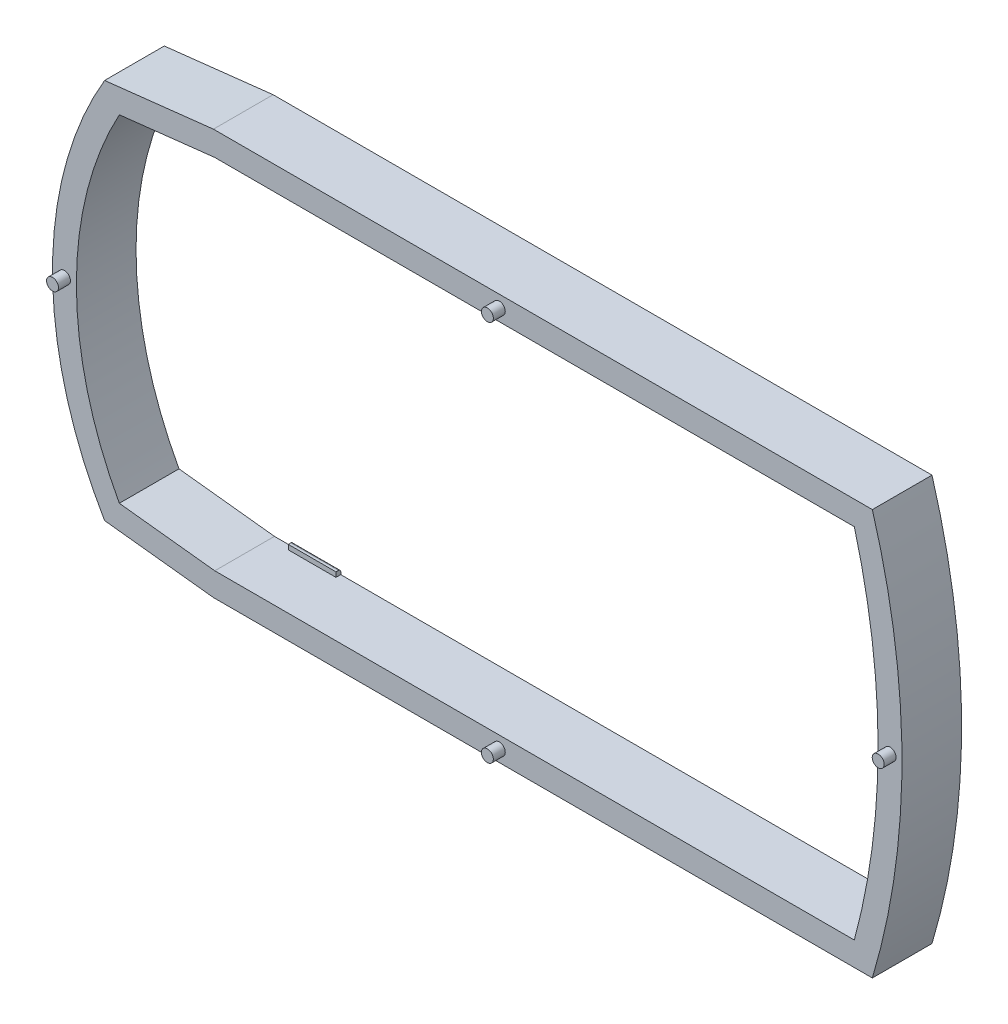
ISO-10303-21;
HEADER;
FILE_DESCRIPTION(('STEP AP214'),'2;1');
FILE_NAME('part.step','',(''),(''),'','','');
FILE_SCHEMA(('AUTOMOTIVE_DESIGN { 1 0 10303 214 1 1 1 1 }'));
ENDSEC;
DATA;
#1=APPLICATION_CONTEXT('core data for automotive mechanical design processes');
#2=APPLICATION_PROTOCOL_DEFINITION('international standard','automotive_design',2000,#1);
#3=PRODUCT_CONTEXT('',#1,'mechanical');
#4=PRODUCT('Part','Part','',(#3));
#5=PRODUCT_RELATED_PRODUCT_CATEGORY('part','',(#4));
#6=PRODUCT_DEFINITION_FORMATION('','',#4);
#7=PRODUCT_DEFINITION_CONTEXT('part definition',#1,'design');
#8=PRODUCT_DEFINITION('design','',#6,#7);
#9=PRODUCT_DEFINITION_SHAPE('','',#8);
#10=(LENGTH_UNIT() NAMED_UNIT(*) SI_UNIT(.MILLI.,.METRE.));
#11=(NAMED_UNIT(*) PLANE_ANGLE_UNIT() SI_UNIT($,.RADIAN.));
#12=(NAMED_UNIT(*) SI_UNIT($,.STERADIAN.) SOLID_ANGLE_UNIT());
#13=UNCERTAINTY_MEASURE_WITH_UNIT(LENGTH_MEASURE(1.E-05),#10,'distance_accuracy_value','');
#14=(GEOMETRIC_REPRESENTATION_CONTEXT(3) GLOBAL_UNCERTAINTY_ASSIGNED_CONTEXT((#13)) GLOBAL_UNIT_ASSIGNED_CONTEXT((#10,
#11,#12)) REPRESENTATION_CONTEXT('',''));
#15=CARTESIAN_POINT('',(0.,0.,0.));
#16=DIRECTION('',(0.,0.,1.));
#17=DIRECTION('',(1.,0.,0.));
#18=AXIS2_PLACEMENT_3D('',#15,#16,#17);
#19=CARTESIAN_POINT('',(0.,-14.6550184722738,2.));
#20=DIRECTION('',(0.,-1.,0.));
#21=DIRECTION('',(1.,0.,0.));
#22=AXIS2_PLACEMENT_3D('',#19,#20,#21);
#23=PLANE('',#22);
#24=DIRECTION('',(-1.,0.,0.));
#25=VECTOR('',#24,1.);
#26=CARTESIAN_POINT('',(0.,-14.6550184722738,0.));
#27=LINE('',#26,#25);
#28=CARTESIAN_POINT('',(124.911892491481,-14.6550184722737,0.));
#29=VERTEX_POINT('',#28);
#30=CARTESIAN_POINT('',(122.411892491481,-14.6550184722737,0.));
#31=VERTEX_POINT('',#30);
#32=EDGE_CURVE('E164',#29,#31,#27,.T.);
#33=ORIENTED_EDGE('',*,*,#32,.T.);
#34=CARTESIAN_POINT('',(122.411892491481,-14.6550184722737,0.5));
#35=DIRECTION('',(0.,-1.,0.));
#36=DIRECTION('',(1.,0.,0.));
#37=AXIS2_PLACEMENT_3D('',#34,#35,#36);
#38=CIRCLE('',#37,0.5);
#39=CARTESIAN_POINT('',(121.911892491481,-14.6550184722737,0.5));
#40=VERTEX_POINT('',#39);
#41=EDGE_CURVE('E13',#31,#40,#38,.F.);
#42=ORIENTED_EDGE('',*,*,#41,.T.);
#43=DIRECTION('',(0.,0.,-1.));
#44=VECTOR('',#43,1.);
#45=CARTESIAN_POINT('',(121.911892491481,-14.6550184722737,2.));
#46=LINE('',#45,#44);
#47=CARTESIAN_POINT('',(121.911892491481,-14.6550184722737,2.));
#48=VERTEX_POINT('',#47);
#49=EDGE_CURVE('E132',#48,#40,#46,.T.);
#50=ORIENTED_EDGE('',*,*,#49,.F.);
#51=DIRECTION('',(-1.,0.,0.));
#52=VECTOR('',#51,1.);
#53=CARTESIAN_POINT('',(0.,-14.6550184722738,2.));
#54=LINE('',#53,#52);
#55=CARTESIAN_POINT('',(124.911892491481,-14.6550184722737,2.));
#56=VERTEX_POINT('',#55);
#57=EDGE_CURVE('E139',#56,#48,#54,.T.);
#58=ORIENTED_EDGE('',*,*,#57,.F.);
#59=DIRECTION('',(0.,0.,-1.));
#60=VECTOR('',#59,1.);
#61=CARTESIAN_POINT('',(124.911892491481,-14.6550184722737,2.));
#62=LINE('',#61,#60);
#63=EDGE_CURVE('E158',#56,#29,#62,.T.);
#64=ORIENTED_EDGE('',*,*,#63,.T.);
#65=EDGE_LOOP('',(#33,#42,#50,#58,#64));
#66=FACE_BOUND('',#65,.T.);
#67=ADVANCED_FACE('F80',(#66),#23,.F.);
#68=CARTESIAN_POINT('',(121.911892491481,0.,2.));
#69=DIRECTION('',(1.,0.,0.));
#70=DIRECTION('',(0.,0.,-1.));
#71=AXIS2_PLACEMENT_3D('',#68,#69,#70);
#72=PLANE('',#71);
#73=ORIENTED_EDGE('',*,*,#49,.T.);
#74=DIRECTION('',(0.,-1.,0.));
#75=VECTOR('',#74,1.);
#76=CARTESIAN_POINT('',(121.911892491481,0.,0.5));
#77=LINE('',#76,#75);
#78=CARTESIAN_POINT('',(121.911892491481,-39.6550184722737,0.5));
#79=VERTEX_POINT('',#78);
#80=EDGE_CURVE('E150',#40,#79,#77,.T.);
#81=ORIENTED_EDGE('',*,*,#80,.T.);
#82=DIRECTION('',(0.,0.,-1.));
#83=VECTOR('',#82,1.);
#84=CARTESIAN_POINT('',(121.911892491481,-39.6550184722737,2.));
#85=LINE('',#84,#83);
#86=CARTESIAN_POINT('',(121.911892491481,-39.6550184722737,2.));
#87=VERTEX_POINT('',#86);
#88=EDGE_CURVE('E134',#87,#79,#85,.T.);
#89=ORIENTED_EDGE('',*,*,#88,.F.);
#90=DIRECTION('',(0.,-1.,0.));
#91=VECTOR('',#90,1.);
#92=CARTESIAN_POINT('',(121.911892491481,0.,2.));
#93=LINE('',#92,#91);
#94=EDGE_CURVE('E127',#48,#87,#93,.T.);
#95=ORIENTED_EDGE('',*,*,#94,.F.);
#96=EDGE_LOOP('',(#73,#81,#89,#95));
#97=FACE_BOUND('',#96,.T.);
#98=ADVANCED_FACE('F129',(#97),#72,.F.);
#99=CARTESIAN_POINT('',(0.,-39.6550184722737,2.));
#100=DIRECTION('',(0.,-1.,0.));
#101=DIRECTION('',(0.,0.,-1.));
#102=AXIS2_PLACEMENT_3D('',#99,#100,#101);
#103=PLANE('',#102);
#104=ORIENTED_EDGE('',*,*,#88,.T.);
#105=CARTESIAN_POINT('',(122.411892491481,-39.6550184722737,0.5));
#106=DIRECTION('',(0.,-1.,0.));
#107=DIRECTION('',(0.,0.,-1.));
#108=AXIS2_PLACEMENT_3D('',#105,#106,#107);
#109=CIRCLE('',#108,0.5);
#110=CARTESIAN_POINT('',(122.411892491481,-39.6550184722737,0.));
#111=VERTEX_POINT('',#110);
#112=EDGE_CURVE('E102',#79,#111,#109,.T.);
#113=ORIENTED_EDGE('',*,*,#112,.T.);
#114=DIRECTION('',(-1.,0.,0.));
#115=VECTOR('',#114,1.);
#116=CARTESIAN_POINT('',(0.,-39.6550184722737,0.));
#117=LINE('',#116,#115);
#118=CARTESIAN_POINT('',(124.911892491481,-39.6550184722737,0.));
#119=VERTEX_POINT('',#118);
#120=EDGE_CURVE('E162',#119,#111,#117,.T.);
#121=ORIENTED_EDGE('',*,*,#120,.F.);
#122=DIRECTION('',(0.,0.,-1.));
#123=VECTOR('',#122,1.);
#124=CARTESIAN_POINT('',(124.911892491481,-39.6550184722737,2.));
#125=LINE('',#124,#123);
#126=CARTESIAN_POINT('',(124.911892491481,-39.6550184722737,2.));
#127=VERTEX_POINT('',#126);
#128=EDGE_CURVE('E153',#127,#119,#125,.T.);
#129=ORIENTED_EDGE('',*,*,#128,.F.);
#130=DIRECTION('',(-1.,0.,0.));
#131=VECTOR('',#130,1.);
#132=CARTESIAN_POINT('',(0.,-39.6550184722737,2.));
#133=LINE('',#132,#131);
#134=EDGE_CURVE('E138',#127,#87,#133,.T.);
#135=ORIENTED_EDGE('',*,*,#134,.T.);
#136=EDGE_LOOP('',(#104,#113,#121,#129,#135));
#137=FACE_BOUND('',#136,.T.);
#138=ADVANCED_FACE('F167',(#137),#103,.T.);
#139=CARTESIAN_POINT('',(124.911892491481,0.,2.));
#140=DIRECTION('',(1.,0.,0.));
#141=DIRECTION('',(0.,0.,-1.));
#142=AXIS2_PLACEMENT_3D('',#139,#140,#141);
#143=PLANE('',#142);
#144=DIRECTION('',(0.,-1.,0.));
#145=VECTOR('',#144,1.);
#146=CARTESIAN_POINT('',(124.911892491481,0.,0.));
#147=LINE('',#146,#145);
#148=EDGE_CURVE('E147',#29,#119,#147,.T.);
#149=ORIENTED_EDGE('',*,*,#148,.F.);
#150=ORIENTED_EDGE('',*,*,#63,.F.);
#151=DIRECTION('',(0.,-1.,0.));
#152=VECTOR('',#151,1.);
#153=CARTESIAN_POINT('',(124.911892491481,0.,2.));
#154=LINE('',#153,#152);
#155=EDGE_CURVE('E145',#56,#127,#154,.T.);
#156=ORIENTED_EDGE('',*,*,#155,.T.);
#157=ORIENTED_EDGE('',*,*,#128,.T.);
#158=EDGE_LOOP('',(#149,#150,#156,#157));
#159=FACE_BOUND('',#158,.T.);
#160=ADVANCED_FACE('F170',(#159),#143,.T.);
#161=CARTESIAN_POINT('',(0.,0.,2.));
#162=DIRECTION('',(0.,0.,1.));
#163=DIRECTION('',(1.,0.,0.));
#164=AXIS2_PLACEMENT_3D('',#161,#162,#163);
#165=PLANE('',#164);
#166=ORIENTED_EDGE('',*,*,#57,.T.);
#167=ORIENTED_EDGE('',*,*,#94,.T.);
#168=ORIENTED_EDGE('',*,*,#134,.F.);
#169=ORIENTED_EDGE('',*,*,#155,.F.);
#170=EDGE_LOOP('',(#166,#167,#168,#169));
#171=FACE_BOUND('',#170,.T.);
#172=ADVANCED_FACE('F143',(#171),#165,.T.);
#173=CARTESIAN_POINT('',(0.,0.,0.));
#174=DIRECTION('',(0.,0.,1.));
#175=DIRECTION('',(1.,0.,0.));
#176=AXIS2_PLACEMENT_3D('',#173,#174,#175);
#177=PLANE('',#176);
#178=ORIENTED_EDGE('',*,*,#120,.T.);
#179=DIRECTION('',(0.,-1.,0.));
#180=VECTOR('',#179,1.);
#181=CARTESIAN_POINT('',(122.411892491481,0.,0.));
#182=LINE('',#181,#180);
#183=EDGE_CURVE('E88',#111,#31,#182,.F.);
#184=ORIENTED_EDGE('',*,*,#183,.T.);
#185=ORIENTED_EDGE('',*,*,#32,.F.);
#186=ORIENTED_EDGE('',*,*,#148,.T.);
#187=EDGE_LOOP('',(#178,#184,#185,#186));
#188=FACE_BOUND('',#187,.T.);
#189=ADVANCED_FACE('F171',(#188),#177,.F.);
#190=CARTESIAN_POINT('',(122.411892491481,0.,0.5));
#191=DIRECTION('',(0.,-1.,0.));
#192=DIRECTION('',(0.,0.,-1.));
#193=AXIS2_PLACEMENT_3D('',#190,#191,#192);
#194=CYLINDRICAL_SURFACE('',#193,0.5);
#195=ORIENTED_EDGE('',*,*,#41,.F.);
#196=ORIENTED_EDGE('',*,*,#183,.F.);
#197=ORIENTED_EDGE('',*,*,#112,.F.);
#198=ORIENTED_EDGE('',*,*,#80,.F.);
#199=EDGE_LOOP('',(#195,#196,#197,#198));
#200=FACE_BOUND('',#199,.T.);
#201=ADVANCED_FACE('F82',(#200),#194,.T.);
#202=CLOSED_SHELL('',(#67,#98,#138,#160,#172,#189,#201));
#203=MANIFOLD_SOLID_BREP('B2',#202);
#204=CARTESIAN_POINT('',(-152.77598661219,-102.155018472274,25.));
#205=DIRECTION('',(0.,1.,0.));
#206=DIRECTION('',(0.,0.,1.));
#207=AXIS2_PLACEMENT_3D('',#204,#205,#206);
#208=PLANE('',#207);
#209=DIRECTION('',(1.,0.,0.));
#210=VECTOR('',#209,1.);
#211=CARTESIAN_POINT('',(-152.77598661219,-102.155018472274,0.));
#212=LINE('',#211,#210);
#213=CARTESIAN_POINT('',(-124.987389645968,-102.155018472274,0.));
#214=VERTEX_POINT('',#213);
#215=CARTESIAN_POINT('',(115.22401338781,-102.155018472274,0.));
#216=VERTEX_POINT('',#215);
#217=EDGE_CURVE('E463',#214,#216,#212,.T.);
#218=ORIENTED_EDGE('',*,*,#217,.F.);
#219=DIRECTION('',(0.,0.,-1.));
#220=VECTOR('',#219,1.);
#221=CARTESIAN_POINT('',(-124.987389645968,-102.155018472274,2.));
#222=LINE('',#221,#220);
#223=CARTESIAN_POINT('',(-124.987389645968,-102.155018472274,2.));
#224=VERTEX_POINT('',#223);
#225=EDGE_CURVE('E441',#224,#214,#222,.T.);
#226=ORIENTED_EDGE('',*,*,#225,.F.);
#227=DIRECTION('',(1.,0.,0.));
#228=VECTOR('',#227,1.);
#229=CARTESIAN_POINT('',(0.,-102.155018472274,2.));
#230=LINE('',#229,#228);
#231=CARTESIAN_POINT('',(-144.987389645968,-102.155018472274,2.));
#232=VERTEX_POINT('',#231);
#233=EDGE_CURVE('E419',#232,#224,#230,.T.);
#234=ORIENTED_EDGE('',*,*,#233,.F.);
#235=DIRECTION('',(0.,0.,-1.));
#236=VECTOR('',#235,1.);
#237=CARTESIAN_POINT('',(-144.987389645968,-102.155018472274,2.));
#238=LINE('',#237,#236);
#239=CARTESIAN_POINT('',(-144.987389645968,-102.155018472274,0.));
#240=VERTEX_POINT('',#239);
#241=EDGE_CURVE('E431',#232,#240,#238,.T.);
#242=ORIENTED_EDGE('',*,*,#241,.T.);
#243=CARTESIAN_POINT('',(-152.77598661219,-102.155018472274,0.));
#244=VERTEX_POINT('',#243);
#245=EDGE_CURVE('E464',#244,#240,#212,.T.);
#246=ORIENTED_EDGE('',*,*,#245,.F.);
#247=DIRECTION('',(0.,0.,-1.));
#248=VECTOR('',#247,1.);
#249=CARTESIAN_POINT('',(-152.77598661219,-102.155018472274,25.));
#250=LINE('',#249,#248);
#251=CARTESIAN_POINT('',(-152.77598661219,-102.155018472274,25.));
#252=VERTEX_POINT('',#251);
#253=EDGE_CURVE('E490',#252,#244,#250,.T.);
#254=ORIENTED_EDGE('',*,*,#253,.F.);
#255=DIRECTION('',(1.,0.,0.));
#256=VECTOR('',#255,1.);
#257=CARTESIAN_POINT('',(-152.77598661219,-102.155018472274,25.));
#258=LINE('',#257,#256);
#259=CARTESIAN_POINT('',(115.22401338781,-102.155018472274,25.));
#260=VERTEX_POINT('',#259);
#261=EDGE_CURVE('E446',#252,#260,#258,.T.);
#262=ORIENTED_EDGE('',*,*,#261,.T.);
#263=DIRECTION('',(0.,0.,-1.));
#264=VECTOR('',#263,1.);
#265=CARTESIAN_POINT('',(115.22401338781,-102.155018472274,25.));
#266=LINE('',#265,#264);
#267=EDGE_CURVE('E487',#260,#216,#266,.T.);
#268=ORIENTED_EDGE('',*,*,#267,.T.);
#269=EDGE_LOOP('',(#218,#226,#234,#242,#246,#254,#262,#268));
#270=FACE_BOUND('',#269,.T.);
#271=ADVANCED_FACE('F229',(#270),#208,.T.);
#272=CARTESIAN_POINT('',(-162.17906632426,-27.1550184722737,25.));
#273=DIRECTION('',(0.,0.,1.));
#274=DIRECTION('',(1.,0.,0.));
#275=AXIS2_PLACEMENT_3D('',#272,#273,#274);
#276=PLANE('',#275);
#277=CARTESIAN_POINT('',(-215.77598661219,-27.1550184722737,25.));
#278=DIRECTION('',(0.,0.,1.));
#279=DIRECTION('',(1.,0.,0.));
#280=AXIS2_PLACEMENT_3D('',#277,#278,#279);
#281=CIRCLE('',#280,2.5);
#282=CARTESIAN_POINT('',(-213.27598661219,-27.1550184722737,25.));
#283=VERTEX_POINT('',#282);
#284=EDGE_CURVE('E610',#283,#283,#281,.F.);
#285=ORIENTED_EDGE('',*,*,#284,.T.);
#286=EDGE_LOOP('',(#285));
#287=FACE_BOUND('',#286,.T.);
#288=CARTESIAN_POINT('',(130.22401338781,-27.1550184722737,25.));
#289=DIRECTION('',(0.,0.,1.));
#290=DIRECTION('',(1.,0.,0.));
#291=AXIS2_PLACEMENT_3D('',#288,#289,#290);
#292=CIRCLE('',#291,2.5);
#293=CARTESIAN_POINT('',(132.72401338781,-27.1550184722737,25.));
#294=VERTEX_POINT('',#293);
#295=EDGE_CURVE('E604',#294,#294,#292,.F.);
#296=ORIENTED_EDGE('',*,*,#295,.T.);
#297=EDGE_LOOP('',(#296));
#298=FACE_BOUND('',#297,.T.);
#299=CARTESIAN_POINT('',(-33.5490270948265,52.8449815277263,25.));
#300=DIRECTION('',(0.,0.,1.));
#301=DIRECTION('',(1.,0.,0.));
#302=AXIS2_PLACEMENT_3D('',#299,#300,#301);
#303=CIRCLE('',#302,2.5);
#304=CARTESIAN_POINT('',(-31.0490270948265,52.8449815277263,25.));
#305=VERTEX_POINT('',#304);
#306=EDGE_CURVE('E598',#305,#305,#303,.F.);
#307=ORIENTED_EDGE('',*,*,#306,.T.);
#308=EDGE_LOOP('',(#307));
#309=FACE_BOUND('',#308,.T.);
#310=CARTESIAN_POINT('',(-33.5490270948265,-107.155018472274,25.));
#311=DIRECTION('',(0.,0.,1.));
#312=DIRECTION('',(1.,0.,0.));
#313=AXIS2_PLACEMENT_3D('',#310,#311,#312);
#314=CIRCLE('',#313,2.5);
#315=CARTESIAN_POINT('',(-31.0490270948265,-107.155018472274,25.));
#316=VERTEX_POINT('',#315);
#317=EDGE_CURVE('E411',#316,#316,#314,.F.);
#318=ORIENTED_EDGE('',*,*,#317,.T.);
#319=EDGE_LOOP('',(#318));
#320=FACE_BOUND('',#319,.T.);
#321=DIRECTION('',(0.993731316158802,-0.111794773067865,0.));
#322=VECTOR('',#321,1.);
#323=CARTESIAN_POINT('',(-193.893934342868,-107.592331633862,25.));
#324=LINE('',#323,#322);
#325=CARTESIAN_POINT('',(-198.953146911768,-107.023170219861,25.));
#326=VERTEX_POINT('',#325);
#327=CARTESIAN_POINT('',(-153.336718001429,-112.155018472274,25.));
#328=VERTEX_POINT('',#327);
#329=EDGE_CURVE('E494',#326,#328,#324,.T.);
#330=ORIENTED_EDGE('',*,*,#329,.T.);
#331=DIRECTION('',(1.,0.,0.));
#332=VECTOR('',#331,1.);
#333=CARTESIAN_POINT('',(-152.77598661219,-112.155018472274,25.));
#334=LINE('',#333,#332);
#335=CARTESIAN_POINT('',(122.776592961627,-112.155018472274,25.));
#336=VERTEX_POINT('',#335);
#337=EDGE_CURVE('E497',#328,#336,#334,.T.);
#338=ORIENTED_EDGE('',*,*,#337,.T.);
#339=CARTESIAN_POINT('',(-162.17906632426,-27.1550184722737,25.));
#340=DIRECTION('',(0.,0.,1.));
#341=DIRECTION('',(1.,0.,0.));
#342=AXIS2_PLACEMENT_3D('',#339,#340,#341);
#343=CIRCLE('',#342,297.362956265663);
#344=CARTESIAN_POINT('',(122.776592961627,57.8449815277263,25.));
#345=VERTEX_POINT('',#344);
#346=EDGE_CURVE('E500',#336,#345,#343,.T.);
#347=ORIENTED_EDGE('',*,*,#346,.T.);
#348=DIRECTION('',(1.,0.,0.));
#349=VECTOR('',#348,1.);
#350=CARTESIAN_POINT('',(-152.77598661219,57.8449815277263,25.));
#351=LINE('',#350,#349);
#352=CARTESIAN_POINT('',(-153.336718001428,57.8449815277263,25.));
#353=VERTEX_POINT('',#352);
#354=EDGE_CURVE('E502',#353,#345,#351,.T.);
#355=ORIENTED_EDGE('',*,*,#354,.F.);
#356=DIRECTION('',(0.993731316158802,0.111794773067865,0.));
#357=VECTOR('',#356,1.);
#358=CARTESIAN_POINT('',(-193.893934342868,53.2822946893143,25.));
#359=LINE('',#358,#357);
#360=CARTESIAN_POINT('',(-198.953146911768,52.713133275313,25.));
#361=VERTEX_POINT('',#360);
#362=EDGE_CURVE('E505',#361,#353,#359,.T.);
#363=ORIENTED_EDGE('',*,*,#362,.F.);
#364=CARTESIAN_POINT('',(-63.7022368600632,-27.1550184722737,25.));
#365=DIRECTION('',(0.,0.,1.));
#366=DIRECTION('',(1.,0.,0.));
#367=AXIS2_PLACEMENT_3D('',#364,#365,#366);
#368=CIRCLE('',#367,157.072372915767);
#369=EDGE_CURVE('E508',#326,#361,#368,.F.);
#370=ORIENTED_EDGE('',*,*,#369,.F.);
#371=EDGE_LOOP('',(#330,#338,#347,#355,#363,#370));
#372=FACE_BOUND('',#371,.T.);
#373=ORIENTED_EDGE('',*,*,#261,.F.);
#374=DIRECTION('',(0.993731316158802,-0.111794773067865,0.));
#375=VECTOR('',#374,1.);
#376=CARTESIAN_POINT('',(-192.77598661219,-97.6550184722737,25.));
#377=LINE('',#376,#375);
#378=CARTESIAN_POINT('',(-192.77598661219,-97.6550184722738,25.));
#379=VERTEX_POINT('',#378);
#380=EDGE_CURVE('E444',#379,#252,#377,.T.);
#381=ORIENTED_EDGE('',*,*,#380,.F.);
#382=CARTESIAN_POINT('',(-63.7022368600632,-27.1550184722737,25.));
#383=DIRECTION('',(0.,0.,-1.));
#384=DIRECTION('',(-1.,0.,0.));
#385=AXIS2_PLACEMENT_3D('',#382,#383,#384);
#386=CIRCLE('',#385,147.072372915767);
#387=CARTESIAN_POINT('',(-192.77598661219,43.3449815277263,25.));
#388=VERTEX_POINT('',#387);
#389=EDGE_CURVE('E457',#379,#388,#386,.T.);
#390=ORIENTED_EDGE('',*,*,#389,.T.);
#391=DIRECTION('',(0.993731316158802,0.111794773067865,0.));
#392=VECTOR('',#391,1.);
#393=CARTESIAN_POINT('',(-192.77598661219,43.3449815277263,25.));
#394=LINE('',#393,#392);
#395=CARTESIAN_POINT('',(-152.77598661219,47.8449815277263,25.));
#396=VERTEX_POINT('',#395);
#397=EDGE_CURVE('E454',#388,#396,#394,.T.);
#398=ORIENTED_EDGE('',*,*,#397,.T.);
#399=DIRECTION('',(1.,0.,0.));
#400=VECTOR('',#399,1.);
#401=CARTESIAN_POINT('',(-152.77598661219,47.8449815277263,25.));
#402=LINE('',#401,#400);
#403=CARTESIAN_POINT('',(115.22401338781,47.8449815277262,25.));
#404=VERTEX_POINT('',#403);
#405=EDGE_CURVE('E451',#396,#404,#402,.T.);
#406=ORIENTED_EDGE('',*,*,#405,.T.);
#407=CARTESIAN_POINT('',(-162.17906632426,-27.1550184722737,25.));
#408=DIRECTION('',(0.,0.,1.));
#409=DIRECTION('',(1.,0.,0.));
#410=AXIS2_PLACEMENT_3D('',#407,#408,#409);
#411=CIRCLE('',#410,287.362956265663);
#412=EDGE_CURVE('E449',#260,#404,#411,.T.);
#413=ORIENTED_EDGE('',*,*,#412,.F.);
#414=EDGE_LOOP('',(#373,#381,#390,#398,#406,#413));
#415=FACE_BOUND('',#414,.T.);
#416=ADVANCED_FACE('F572',(#287,#298,#309,#320,#372,#415),#276,.T.);
#417=CARTESIAN_POINT('',(-162.17906632426,-27.1550184722737,0.));
#418=DIRECTION('',(0.,0.,1.));
#419=DIRECTION('',(1.,0.,0.));
#420=AXIS2_PLACEMENT_3D('',#417,#418,#419);
#421=PLANE('',#420);
#422=DIRECTION('',(0.993731316158802,-0.111794773067865,0.));
#423=VECTOR('',#422,1.);
#424=CARTESIAN_POINT('',(-193.893934342868,-107.592331633862,0.));
#425=LINE('',#424,#423);
#426=CARTESIAN_POINT('',(-198.953146911768,-107.023170219861,0.));
#427=VERTEX_POINT('',#426);
#428=CARTESIAN_POINT('',(-153.336718001429,-112.155018472274,0.));
#429=VERTEX_POINT('',#428);
#430=EDGE_CURVE('E493',#427,#429,#425,.T.);
#431=ORIENTED_EDGE('',*,*,#430,.F.);
#432=CARTESIAN_POINT('',(-63.7022368600632,-27.1550184722737,0.));
#433=DIRECTION('',(0.,0.,1.));
#434=DIRECTION('',(1.,0.,0.));
#435=AXIS2_PLACEMENT_3D('',#432,#433,#434);
#436=CIRCLE('',#435,157.072372915767);
#437=CARTESIAN_POINT('',(-198.953146911768,52.713133275313,0.));
#438=VERTEX_POINT('',#437);
#439=EDGE_CURVE('E498',#427,#438,#436,.F.);
#440=ORIENTED_EDGE('',*,*,#439,.T.);
#441=DIRECTION('',(0.993731316158802,0.111794773067865,0.));
#442=VECTOR('',#441,1.);
#443=CARTESIAN_POINT('',(-193.893934342868,53.2822946893143,0.));
#444=LINE('',#443,#442);
#445=CARTESIAN_POINT('',(-153.336718001428,57.8449815277263,0.));
#446=VERTEX_POINT('',#445);
#447=EDGE_CURVE('E522',#438,#446,#444,.T.);
#448=ORIENTED_EDGE('',*,*,#447,.T.);
#449=DIRECTION('',(1.,0.,0.));
#450=VECTOR('',#449,1.);
#451=CARTESIAN_POINT('',(-152.77598661219,57.8449815277263,0.));
#452=LINE('',#451,#450);
#453=CARTESIAN_POINT('',(122.776592961627,57.8449815277263,0.));
#454=VERTEX_POINT('',#453);
#455=EDGE_CURVE('E519',#446,#454,#452,.T.);
#456=ORIENTED_EDGE('',*,*,#455,.T.);
#457=CARTESIAN_POINT('',(-162.17906632426,-27.1550184722737,0.));
#458=DIRECTION('',(0.,0.,1.));
#459=DIRECTION('',(1.,0.,0.));
#460=AXIS2_PLACEMENT_3D('',#457,#458,#459);
#461=CIRCLE('',#460,297.362956265663);
#462=CARTESIAN_POINT('',(122.776592961627,-112.155018472274,0.));
#463=VERTEX_POINT('',#462);
#464=EDGE_CURVE('E516',#463,#454,#461,.T.);
#465=ORIENTED_EDGE('',*,*,#464,.F.);
#466=DIRECTION('',(1.,0.,0.));
#467=VECTOR('',#466,1.);
#468=CARTESIAN_POINT('',(-152.77598661219,-112.155018472274,0.));
#469=LINE('',#468,#467);
#470=EDGE_CURVE('E514',#429,#463,#469,.T.);
#471=ORIENTED_EDGE('',*,*,#470,.F.);
#472=EDGE_LOOP('',(#431,#440,#448,#456,#465,#471));
#473=FACE_BOUND('',#472,.T.);
#474=DIRECTION('',(0.,1.,0.));
#475=VECTOR('',#474,1.);
#476=CARTESIAN_POINT('',(-144.987389645968,0.,0.));
#477=LINE('',#476,#475);
#478=CARTESIAN_POINT('',(-144.987389645968,-101.155018472274,0.));
#479=VERTEX_POINT('',#478);
#480=EDGE_CURVE('E423',#240,#479,#477,.T.);
#481=ORIENTED_EDGE('',*,*,#480,.T.);
#482=DIRECTION('',(1.,0.,0.));
#483=VECTOR('',#482,1.);
#484=CARTESIAN_POINT('',(-124.987389645968,-101.155018472274,0.));
#485=LINE('',#484,#483);
#486=CARTESIAN_POINT('',(-124.987389645968,-101.155018472274,0.));
#487=VERTEX_POINT('',#486);
#488=EDGE_CURVE('E547',#479,#487,#485,.T.);
#489=ORIENTED_EDGE('',*,*,#488,.T.);
#490=DIRECTION('',(0.,1.,0.));
#491=VECTOR('',#490,1.);
#492=CARTESIAN_POINT('',(-124.987389645968,0.,0.));
#493=LINE('',#492,#491);
#494=EDGE_CURVE('E418',#214,#487,#493,.T.);
#495=ORIENTED_EDGE('',*,*,#494,.F.);
#496=ORIENTED_EDGE('',*,*,#217,.T.);
#497=CARTESIAN_POINT('',(-162.17906632426,-27.1550184722737,0.));
#498=DIRECTION('',(0.,0.,1.));
#499=DIRECTION('',(1.,0.,0.));
#500=AXIS2_PLACEMENT_3D('',#497,#498,#499);
#501=CIRCLE('',#500,287.362956265663);
#502=CARTESIAN_POINT('',(115.22401338781,47.8449815277262,0.));
#503=VERTEX_POINT('',#502);
#504=EDGE_CURVE('E467',#216,#503,#501,.T.);
#505=ORIENTED_EDGE('',*,*,#504,.T.);
#506=DIRECTION('',(1.,0.,0.));
#507=VECTOR('',#506,1.);
#508=CARTESIAN_POINT('',(-152.77598661219,47.8449815277263,0.));
#509=LINE('',#508,#507);
#510=CARTESIAN_POINT('',(-124.987389645968,47.8449815277263,0.));
#511=VERTEX_POINT('',#510);
#512=EDGE_CURVE('E470',#511,#503,#509,.T.);
#513=ORIENTED_EDGE('',*,*,#512,.F.);
#514=DIRECTION('',(0.,-1.,0.));
#515=VECTOR('',#514,1.);
#516=CARTESIAN_POINT('',(-124.987389645968,8.67274236079684E-13,0.));
#517=LINE('',#516,#515);
#518=CARTESIAN_POINT('',(-124.987389645968,46.8449815277263,0.));
#519=VERTEX_POINT('',#518);
#520=EDGE_CURVE('E407',#511,#519,#517,.T.);
#521=ORIENTED_EDGE('',*,*,#520,.T.);
#522=DIRECTION('',(1.,0.,0.));
#523=VECTOR('',#522,1.);
#524=CARTESIAN_POINT('',(-162.17906632426,46.8449815277263,0.));
#525=LINE('',#524,#523);
#526=CARTESIAN_POINT('',(-144.987389645968,46.8449815277263,0.));
#527=VERTEX_POINT('',#526);
#528=EDGE_CURVE('E544',#519,#527,#525,.F.);
#529=ORIENTED_EDGE('',*,*,#528,.T.);
#530=DIRECTION('',(0.,-1.,0.));
#531=VECTOR('',#530,1.);
#532=CARTESIAN_POINT('',(-144.987389645968,0.,0.));
#533=LINE('',#532,#531);
#534=CARTESIAN_POINT('',(-144.987389645968,47.8449815277263,0.));
#535=VERTEX_POINT('',#534);
#536=EDGE_CURVE('E410',#535,#527,#533,.T.);
#537=ORIENTED_EDGE('',*,*,#536,.F.);
#538=CARTESIAN_POINT('',(-152.77598661219,47.8449815277263,0.));
#539=VERTEX_POINT('',#538);
#540=EDGE_CURVE('E471',#539,#535,#509,.T.);
#541=ORIENTED_EDGE('',*,*,#540,.F.);
#542=DIRECTION('',(0.993731316158802,0.111794773067865,0.));
#543=VECTOR('',#542,1.);
#544=CARTESIAN_POINT('',(-192.77598661219,43.3449815277263,0.));
#545=LINE('',#544,#543);
#546=CARTESIAN_POINT('',(-192.77598661219,43.3449815277263,0.));
#547=VERTEX_POINT('',#546);
#548=EDGE_CURVE('E473',#547,#539,#545,.T.);
#549=ORIENTED_EDGE('',*,*,#548,.F.);
#550=CARTESIAN_POINT('',(-63.7022368600632,-27.1550184722737,0.));
#551=DIRECTION('',(0.,0.,-1.));
#552=DIRECTION('',(-1.,0.,0.));
#553=AXIS2_PLACEMENT_3D('',#550,#551,#552);
#554=CIRCLE('',#553,147.072372915767);
#555=CARTESIAN_POINT('',(-192.77598661219,-97.6550184722738,0.));
#556=VERTEX_POINT('',#555);
#557=EDGE_CURVE('E447',#556,#547,#554,.T.);
#558=ORIENTED_EDGE('',*,*,#557,.F.);
#559=DIRECTION('',(0.993731316158802,-0.111794773067865,0.));
#560=VECTOR('',#559,1.);
#561=CARTESIAN_POINT('',(-192.77598661219,-97.6550184722737,0.));
#562=LINE('',#561,#560);
#563=EDGE_CURVE('E443',#556,#244,#562,.T.);
#564=ORIENTED_EDGE('',*,*,#563,.T.);
#565=ORIENTED_EDGE('',*,*,#245,.T.);
#566=EDGE_LOOP('',(#481,#489,#495,#496,#505,#513,#521,#529,#537,#541,#549,#558,#564,#565));
#567=FACE_BOUND('',#566,.T.);
#568=ADVANCED_FACE('F553',(#473,#567),#421,.F.);
#569=CARTESIAN_POINT('',(-193.893934342868,-107.592331633862,25.));
#570=DIRECTION('',(0.111794773067865,0.993731316158802,0.));
#571=DIRECTION('',(-0.993731316158802,0.111794773067865,0.));
#572=AXIS2_PLACEMENT_3D('',#569,#570,#571);
#573=PLANE('',#572);
#574=ORIENTED_EDGE('',*,*,#430,.T.);
#575=DIRECTION('',(0.,0.,-1.));
#576=VECTOR('',#575,1.);
#577=CARTESIAN_POINT('',(-153.336718001429,-112.155018472274,25.));
#578=LINE('',#577,#576);
#579=EDGE_CURVE('E537',#328,#429,#578,.T.);
#580=ORIENTED_EDGE('',*,*,#579,.F.);
#581=ORIENTED_EDGE('',*,*,#329,.F.);
#582=DIRECTION('',(0.,0.,-1.));
#583=VECTOR('',#582,1.);
#584=CARTESIAN_POINT('',(-198.953146911768,-107.023170219861,25.));
#585=LINE('',#584,#583);
#586=EDGE_CURVE('E511',#326,#427,#585,.T.);
#587=ORIENTED_EDGE('',*,*,#586,.T.);
#588=EDGE_LOOP('',(#574,#580,#581,#587));
#589=FACE_BOUND('',#588,.T.);
#590=ADVANCED_FACE('F650',(#589),#573,.F.);
#591=CARTESIAN_POINT('',(-152.77598661219,-112.155018472274,25.));
#592=DIRECTION('',(0.,1.,0.));
#593=DIRECTION('',(0.,0.,1.));
#594=AXIS2_PLACEMENT_3D('',#591,#592,#593);
#595=PLANE('',#594);
#596=ORIENTED_EDGE('',*,*,#470,.T.);
#597=DIRECTION('',(0.,0.,-1.));
#598=VECTOR('',#597,1.);
#599=CARTESIAN_POINT('',(122.776592961627,-112.155018472274,25.));
#600=LINE('',#599,#598);
#601=EDGE_CURVE('E534',#336,#463,#600,.T.);
#602=ORIENTED_EDGE('',*,*,#601,.F.);
#603=ORIENTED_EDGE('',*,*,#337,.F.);
#604=ORIENTED_EDGE('',*,*,#579,.T.);
#605=EDGE_LOOP('',(#596,#602,#603,#604));
#606=FACE_BOUND('',#605,.T.);
#607=ADVANCED_FACE('F666',(#606),#595,.F.);
#608=CARTESIAN_POINT('',(-162.17906632426,-27.1550184722737,25.));
#609=DIRECTION('',(0.,0.,-1.));
#610=DIRECTION('',(-1.,0.,0.));
#611=AXIS2_PLACEMENT_3D('',#608,#609,#610);
#612=CYLINDRICAL_SURFACE('',#611,297.362956265663);
#613=ORIENTED_EDGE('',*,*,#464,.T.);
#614=DIRECTION('',(0.,0.,-1.));
#615=VECTOR('',#614,1.);
#616=CARTESIAN_POINT('',(122.776592961627,57.8449815277263,25.));
#617=LINE('',#616,#615);
#618=EDGE_CURVE('E532',#345,#454,#617,.T.);
#619=ORIENTED_EDGE('',*,*,#618,.F.);
#620=ORIENTED_EDGE('',*,*,#346,.F.);
#621=ORIENTED_EDGE('',*,*,#601,.T.);
#622=EDGE_LOOP('',(#613,#619,#620,#621));
#623=FACE_BOUND('',#622,.T.);
#624=ADVANCED_FACE('F662',(#623),#612,.T.);
#625=CARTESIAN_POINT('',(-152.77598661219,57.8449815277263,25.));
#626=DIRECTION('',(0.,1.,0.));
#627=DIRECTION('',(0.,0.,1.));
#628=AXIS2_PLACEMENT_3D('',#625,#626,#627);
#629=PLANE('',#628);
#630=ORIENTED_EDGE('',*,*,#455,.F.);
#631=DIRECTION('',(0.,0.,-1.));
#632=VECTOR('',#631,1.);
#633=CARTESIAN_POINT('',(-153.336718001428,57.8449815277263,25.));
#634=LINE('',#633,#632);
#635=EDGE_CURVE('E530',#353,#446,#634,.T.);
#636=ORIENTED_EDGE('',*,*,#635,.F.);
#637=ORIENTED_EDGE('',*,*,#354,.T.);
#638=ORIENTED_EDGE('',*,*,#618,.T.);
#639=EDGE_LOOP('',(#630,#636,#637,#638));
#640=FACE_BOUND('',#639,.T.);
#641=ADVANCED_FACE('F658',(#640),#629,.T.);
#642=CARTESIAN_POINT('',(-193.893934342868,53.2822946893143,25.));
#643=DIRECTION('',(-0.111794773067865,0.993731316158802,0.));
#644=DIRECTION('',(-0.993731316158802,-0.111794773067865,0.));
#645=AXIS2_PLACEMENT_3D('',#642,#643,#644);
#646=PLANE('',#645);
#647=ORIENTED_EDGE('',*,*,#447,.F.);
#648=DIRECTION('',(0.,0.,-1.));
#649=VECTOR('',#648,1.);
#650=CARTESIAN_POINT('',(-198.953146911768,52.713133275313,25.));
#651=LINE('',#650,#649);
#652=EDGE_CURVE('E528',#361,#438,#651,.T.);
#653=ORIENTED_EDGE('',*,*,#652,.F.);
#654=ORIENTED_EDGE('',*,*,#362,.T.);
#655=ORIENTED_EDGE('',*,*,#635,.T.);
#656=EDGE_LOOP('',(#647,#653,#654,#655));
#657=FACE_BOUND('',#656,.T.);
#658=ADVANCED_FACE('F654',(#657),#646,.T.);
#659=CARTESIAN_POINT('',(-63.7022368600632,-27.1550184722737,25.));
#660=DIRECTION('',(0.,0.,-1.));
#661=DIRECTION('',(-1.,0.,0.));
#662=AXIS2_PLACEMENT_3D('',#659,#660,#661);
#663=CYLINDRICAL_SURFACE('',#662,157.072372915767);
#664=ORIENTED_EDGE('',*,*,#439,.F.);
#665=ORIENTED_EDGE('',*,*,#586,.F.);
#666=ORIENTED_EDGE('',*,*,#369,.T.);
#667=ORIENTED_EDGE('',*,*,#652,.T.);
#668=EDGE_LOOP('',(#664,#665,#666,#667));
#669=FACE_BOUND('',#668,.T.);
#670=ADVANCED_FACE('F645',(#669),#663,.T.);
#671=CARTESIAN_POINT('',(-192.77598661219,-97.6550184722737,25.));
#672=DIRECTION('',(0.111794773067865,0.993731316158802,0.));
#673=DIRECTION('',(-0.993731316158802,0.111794773067865,0.));
#674=AXIS2_PLACEMENT_3D('',#671,#672,#673);
#675=PLANE('',#674);
#676=ORIENTED_EDGE('',*,*,#563,.F.);
#677=DIRECTION('',(0.,0.,-1.));
#678=VECTOR('',#677,1.);
#679=CARTESIAN_POINT('',(-192.77598661219,-97.6550184722738,25.));
#680=LINE('',#679,#678);
#681=EDGE_CURVE('E460',#379,#556,#680,.T.);
#682=ORIENTED_EDGE('',*,*,#681,.F.);
#683=ORIENTED_EDGE('',*,*,#380,.T.);
#684=ORIENTED_EDGE('',*,*,#253,.T.);
#685=EDGE_LOOP('',(#676,#682,#683,#684));
#686=FACE_BOUND('',#685,.T.);
#687=ADVANCED_FACE('F643',(#686),#675,.T.);
#688=CARTESIAN_POINT('',(-162.17906632426,-27.1550184722737,25.));
#689=DIRECTION('',(0.,0.,-1.));
#690=DIRECTION('',(-1.,0.,0.));
#691=AXIS2_PLACEMENT_3D('',#688,#689,#690);
#692=CYLINDRICAL_SURFACE('',#691,287.362956265663);
#693=ORIENTED_EDGE('',*,*,#504,.F.);
#694=ORIENTED_EDGE('',*,*,#267,.F.);
#695=ORIENTED_EDGE('',*,*,#412,.T.);
#696=DIRECTION('',(0.,0.,-1.));
#697=VECTOR('',#696,1.);
#698=CARTESIAN_POINT('',(115.22401338781,47.8449815277262,25.));
#699=LINE('',#698,#697);
#700=EDGE_CURVE('E484',#404,#503,#699,.T.);
#701=ORIENTED_EDGE('',*,*,#700,.T.);
#702=EDGE_LOOP('',(#693,#694,#695,#701));
#703=FACE_BOUND('',#702,.T.);
#704=ADVANCED_FACE('F564',(#703),#692,.F.);
#705=CARTESIAN_POINT('',(-152.77598661219,47.8449815277263,25.));
#706=DIRECTION('',(0.,1.,0.));
#707=DIRECTION('',(0.,0.,1.));
#708=AXIS2_PLACEMENT_3D('',#705,#706,#707);
#709=PLANE('',#708);
#710=DIRECTION('',(1.,0.,0.));
#711=VECTOR('',#710,1.);
#712=CARTESIAN_POINT('',(0.,47.8449815277263,2.));
#713=LINE('',#712,#711);
#714=CARTESIAN_POINT('',(-144.987389645968,47.8449815277263,2.));
#715=VERTEX_POINT('',#714);
#716=CARTESIAN_POINT('',(-124.987389645968,47.8449815277263,2.));
#717=VERTEX_POINT('',#716);
#718=EDGE_CURVE('E384',#715,#717,#713,.T.);
#719=ORIENTED_EDGE('',*,*,#718,.T.);
#720=DIRECTION('',(0.,0.,-1.));
#721=VECTOR('',#720,1.);
#722=CARTESIAN_POINT('',(-124.987389645968,47.8449815277263,2.));
#723=LINE('',#722,#721);
#724=EDGE_CURVE('E415',#717,#511,#723,.T.);
#725=ORIENTED_EDGE('',*,*,#724,.T.);
#726=ORIENTED_EDGE('',*,*,#512,.T.);
#727=ORIENTED_EDGE('',*,*,#700,.F.);
#728=ORIENTED_EDGE('',*,*,#405,.F.);
#729=DIRECTION('',(0.,0.,-1.));
#730=VECTOR('',#729,1.);
#731=CARTESIAN_POINT('',(-152.77598661219,47.8449815277263,25.));
#732=LINE('',#731,#730);
#733=EDGE_CURVE('E482',#396,#539,#732,.T.);
#734=ORIENTED_EDGE('',*,*,#733,.T.);
#735=ORIENTED_EDGE('',*,*,#540,.T.);
#736=DIRECTION('',(0.,0.,-1.));
#737=VECTOR('',#736,1.);
#738=CARTESIAN_POINT('',(-144.987389645968,47.8449815277263,2.));
#739=LINE('',#738,#737);
#740=EDGE_CURVE('E397',#715,#535,#739,.T.);
#741=ORIENTED_EDGE('',*,*,#740,.F.);
#742=EDGE_LOOP('',(#719,#725,#726,#727,#728,#734,#735,#741));
#743=FACE_BOUND('',#742,.T.);
#744=ADVANCED_FACE('F569',(#743),#709,.F.);
#745=CARTESIAN_POINT('',(-192.77598661219,43.3449815277263,25.));
#746=DIRECTION('',(-0.111794773067865,0.993731316158802,0.));
#747=DIRECTION('',(-0.993731316158802,-0.111794773067865,0.));
#748=AXIS2_PLACEMENT_3D('',#745,#746,#747);
#749=PLANE('',#748);
#750=ORIENTED_EDGE('',*,*,#548,.T.);
#751=ORIENTED_EDGE('',*,*,#733,.F.);
#752=ORIENTED_EDGE('',*,*,#397,.F.);
#753=DIRECTION('',(0.,0.,-1.));
#754=VECTOR('',#753,1.);
#755=CARTESIAN_POINT('',(-192.77598661219,43.3449815277263,25.));
#756=LINE('',#755,#754);
#757=EDGE_CURVE('E480',#388,#547,#756,.T.);
#758=ORIENTED_EDGE('',*,*,#757,.T.);
#759=EDGE_LOOP('',(#750,#751,#752,#758));
#760=FACE_BOUND('',#759,.T.);
#761=ADVANCED_FACE('F577',(#760),#749,.F.);
#762=CARTESIAN_POINT('',(-63.7022368600632,-27.1550184722737,25.));
#763=DIRECTION('',(0.,0.,-1.));
#764=DIRECTION('',(-1.,0.,0.));
#765=AXIS2_PLACEMENT_3D('',#762,#763,#764);
#766=CYLINDRICAL_SURFACE('',#765,147.072372915767);
#767=ORIENTED_EDGE('',*,*,#557,.T.);
#768=ORIENTED_EDGE('',*,*,#757,.F.);
#769=ORIENTED_EDGE('',*,*,#389,.F.);
#770=ORIENTED_EDGE('',*,*,#681,.T.);
#771=EDGE_LOOP('',(#767,#768,#769,#770));
#772=FACE_BOUND('',#771,.T.);
#773=ADVANCED_FACE('F579',(#772),#766,.F.);
#774=CARTESIAN_POINT('',(-124.987389645968,0.,2.));
#775=DIRECTION('',(-1.,0.,0.));
#776=DIRECTION('',(0.,0.,1.));
#777=AXIS2_PLACEMENT_3D('',#774,#775,#776);
#778=PLANE('',#777);
#779=ORIENTED_EDGE('',*,*,#494,.T.);
#780=CARTESIAN_POINT('',(-124.987389645968,-101.155018472274,1.));
#781=DIRECTION('',(-1.,0.,0.));
#782=DIRECTION('',(0.,0.,1.));
#783=AXIS2_PLACEMENT_3D('',#780,#781,#782);
#784=CIRCLE('',#783,1.);
#785=CARTESIAN_POINT('',(-124.987389645968,-100.155018472274,1.));
#786=VERTEX_POINT('',#785);
#787=EDGE_CURVE('E251',#487,#786,#784,.F.);
#788=ORIENTED_EDGE('',*,*,#787,.T.);
#789=DIRECTION('',(0.,0.,-1.));
#790=VECTOR('',#789,1.);
#791=CARTESIAN_POINT('',(-124.987389645968,-100.155018472274,2.));
#792=LINE('',#791,#790);
#793=CARTESIAN_POINT('',(-124.987389645968,-100.155018472274,2.));
#794=VERTEX_POINT('',#793);
#795=EDGE_CURVE('E439',#794,#786,#792,.T.);
#796=ORIENTED_EDGE('',*,*,#795,.F.);
#797=DIRECTION('',(0.,1.,0.));
#798=VECTOR('',#797,1.);
#799=CARTESIAN_POINT('',(-124.987389645968,0.,2.));
#800=LINE('',#799,#798);
#801=EDGE_CURVE('E422',#224,#794,#800,.T.);
#802=ORIENTED_EDGE('',*,*,#801,.F.);
#803=ORIENTED_EDGE('',*,*,#225,.T.);
#804=EDGE_LOOP('',(#779,#788,#796,#802,#803));
#805=FACE_BOUND('',#804,.T.);
#806=ADVANCED_FACE('F557',(#805),#778,.F.);
#807=CARTESIAN_POINT('',(0.,-100.155018472274,2.));
#808=DIRECTION('',(0.,1.,0.));
#809=DIRECTION('',(0.,0.,1.));
#810=AXIS2_PLACEMENT_3D('',#807,#808,#809);
#811=PLANE('',#810);
#812=ORIENTED_EDGE('',*,*,#795,.T.);
#813=DIRECTION('',(1.,0.,0.));
#814=VECTOR('',#813,1.);
#815=CARTESIAN_POINT('',(-144.987389645968,-100.155018472274,1.));
#816=LINE('',#815,#814);
#817=CARTESIAN_POINT('',(-144.987389645968,-100.155018472274,1.));
#818=VERTEX_POINT('',#817);
#819=EDGE_CURVE('E237',#786,#818,#816,.F.);
#820=ORIENTED_EDGE('',*,*,#819,.T.);
#821=DIRECTION('',(0.,0.,-1.));
#822=VECTOR('',#821,1.);
#823=CARTESIAN_POINT('',(-144.987389645968,-100.155018472274,2.));
#824=LINE('',#823,#822);
#825=CARTESIAN_POINT('',(-144.987389645968,-100.155018472274,2.));
#826=VERTEX_POINT('',#825);
#827=EDGE_CURVE('E437',#826,#818,#824,.T.);
#828=ORIENTED_EDGE('',*,*,#827,.F.);
#829=DIRECTION('',(1.,0.,0.));
#830=VECTOR('',#829,1.);
#831=CARTESIAN_POINT('',(0.,-100.155018472274,2.));
#832=LINE('',#831,#830);
#833=EDGE_CURVE('E425',#826,#794,#832,.T.);
#834=ORIENTED_EDGE('',*,*,#833,.T.);
#835=EDGE_LOOP('',(#812,#820,#828,#834));
#836=FACE_BOUND('',#835,.T.);
#837=ADVANCED_FACE('F698',(#836),#811,.T.);
#838=CARTESIAN_POINT('',(-144.987389645968,0.,2.));
#839=DIRECTION('',(-1.,0.,0.));
#840=DIRECTION('',(0.,0.,1.));
#841=AXIS2_PLACEMENT_3D('',#838,#839,#840);
#842=PLANE('',#841);
#843=ORIENTED_EDGE('',*,*,#827,.T.);
#844=CARTESIAN_POINT('',(-144.987389645968,-101.155018472274,1.));
#845=DIRECTION('',(-1.,0.,0.));
#846=DIRECTION('',(0.,0.,1.));
#847=AXIS2_PLACEMENT_3D('',#844,#845,#846);
#848=CIRCLE('',#847,1.);
#849=EDGE_CURVE('E78',#818,#479,#848,.T.);
#850=ORIENTED_EDGE('',*,*,#849,.T.);
#851=ORIENTED_EDGE('',*,*,#480,.F.);
#852=ORIENTED_EDGE('',*,*,#241,.F.);
#853=DIRECTION('',(0.,1.,0.));
#854=VECTOR('',#853,1.);
#855=CARTESIAN_POINT('',(-144.987389645968,0.,2.));
#856=LINE('',#855,#854);
#857=EDGE_CURVE('E428',#232,#826,#856,.T.);
#858=ORIENTED_EDGE('',*,*,#857,.T.);
#859=EDGE_LOOP('',(#843,#850,#851,#852,#858));
#860=FACE_BOUND('',#859,.T.);
#861=ADVANCED_FACE('F694',(#860),#842,.T.);
#862=CARTESIAN_POINT('',(0.,0.,2.));
#863=DIRECTION('',(0.,0.,1.));
#864=DIRECTION('',(1.,0.,0.));
#865=AXIS2_PLACEMENT_3D('',#862,#863,#864);
#866=PLANE('',#865);
#867=ORIENTED_EDGE('',*,*,#233,.T.);
#868=ORIENTED_EDGE('',*,*,#801,.T.);
#869=ORIENTED_EDGE('',*,*,#833,.F.);
#870=ORIENTED_EDGE('',*,*,#857,.F.);
#871=EDGE_LOOP('',(#867,#868,#869,#870));
#872=FACE_BOUND('',#871,.T.);
#873=ADVANCED_FACE('F691',(#872),#866,.T.);
#874=CARTESIAN_POINT('',(-124.987389645968,8.67274236079684E-13,2.));
#875=DIRECTION('',(1.,0.,0.));
#876=DIRECTION('',(0.,1.,0.));
#877=AXIS2_PLACEMENT_3D('',#874,#875,#876);
#878=PLANE('',#877);
#879=DIRECTION('',(0.,0.,-1.));
#880=VECTOR('',#879,1.);
#881=CARTESIAN_POINT('',(-124.987389645968,45.8449815277263,2.));
#882=LINE('',#881,#880);
#883=CARTESIAN_POINT('',(-124.987389645968,45.8449815277263,2.));
#884=VERTEX_POINT('',#883);
#885=CARTESIAN_POINT('',(-124.987389645968,45.8449815277263,1.));
#886=VERTEX_POINT('',#885);
#887=EDGE_CURVE('E398',#884,#886,#882,.T.);
#888=ORIENTED_EDGE('',*,*,#887,.T.);
#889=CARTESIAN_POINT('',(-124.987389645968,46.8449815277263,1.));
#890=DIRECTION('',(1.,0.,0.));
#891=DIRECTION('',(0.,1.,0.));
#892=AXIS2_PLACEMENT_3D('',#889,#890,#891);
#893=CIRCLE('',#892,1.);
#894=EDGE_CURVE('E542',#886,#519,#893,.T.);
#895=ORIENTED_EDGE('',*,*,#894,.T.);
#896=ORIENTED_EDGE('',*,*,#520,.F.);
#897=ORIENTED_EDGE('',*,*,#724,.F.);
#898=DIRECTION('',(0.,-1.,0.));
#899=VECTOR('',#898,1.);
#900=CARTESIAN_POINT('',(-124.987389645968,8.67274236079684E-13,2.));
#901=LINE('',#900,#899);
#902=EDGE_CURVE('E412',#717,#884,#901,.T.);
#903=ORIENTED_EDGE('',*,*,#902,.T.);
#904=EDGE_LOOP('',(#888,#895,#896,#897,#903));
#905=FACE_BOUND('',#904,.T.);
#906=ADVANCED_FACE('F588',(#905),#878,.T.);
#907=CARTESIAN_POINT('',(-144.987389645968,0.,2.));
#908=DIRECTION('',(1.,0.,0.));
#909=DIRECTION('',(0.,0.,-1.));
#910=AXIS2_PLACEMENT_3D('',#907,#908,#909);
#911=PLANE('',#910);
#912=ORIENTED_EDGE('',*,*,#536,.T.);
#913=CARTESIAN_POINT('',(-144.987389645968,46.8449815277263,1.));
#914=DIRECTION('',(1.,0.,0.));
#915=DIRECTION('',(0.,0.,-1.));
#916=AXIS2_PLACEMENT_3D('',#913,#914,#915);
#917=CIRCLE('',#916,1.);
#918=CARTESIAN_POINT('',(-144.987389645968,45.8449815277263,1.));
#919=VERTEX_POINT('',#918);
#920=EDGE_CURVE('E393',#527,#919,#917,.F.);
#921=ORIENTED_EDGE('',*,*,#920,.T.);
#922=DIRECTION('',(0.,0.,-1.));
#923=VECTOR('',#922,1.);
#924=CARTESIAN_POINT('',(-144.987389645968,45.8449815277263,2.));
#925=LINE('',#924,#923);
#926=CARTESIAN_POINT('',(-144.987389645968,45.8449815277263,2.));
#927=VERTEX_POINT('',#926);
#928=EDGE_CURVE('E389',#927,#919,#925,.T.);
#929=ORIENTED_EDGE('',*,*,#928,.F.);
#930=DIRECTION('',(0.,-1.,0.));
#931=VECTOR('',#930,1.);
#932=CARTESIAN_POINT('',(-144.987389645968,0.,2.));
#933=LINE('',#932,#931);
#934=EDGE_CURVE('E377',#715,#927,#933,.T.);
#935=ORIENTED_EDGE('',*,*,#934,.F.);
#936=ORIENTED_EDGE('',*,*,#740,.T.);
#937=EDGE_LOOP('',(#912,#921,#929,#935,#936));
#938=FACE_BOUND('',#937,.T.);
#939=ADVANCED_FACE('F391',(#938),#911,.F.);
#940=CARTESIAN_POINT('',(0.,45.8449815277263,2.));
#941=DIRECTION('',(0.,1.,0.));
#942=DIRECTION('',(0.,0.,1.));
#943=AXIS2_PLACEMENT_3D('',#940,#941,#942);
#944=PLANE('',#943);
#945=ORIENTED_EDGE('',*,*,#928,.T.);
#946=DIRECTION('',(1.,0.,0.));
#947=VECTOR('',#946,1.);
#948=CARTESIAN_POINT('',(0.,45.8449815277263,1.));
#949=LINE('',#948,#947);
#950=EDGE_CURVE('E540',#919,#886,#949,.T.);
#951=ORIENTED_EDGE('',*,*,#950,.T.);
#952=ORIENTED_EDGE('',*,*,#887,.F.);
#953=DIRECTION('',(1.,0.,0.));
#954=VECTOR('',#953,1.);
#955=CARTESIAN_POINT('',(0.,45.8449815277263,2.));
#956=LINE('',#955,#954);
#957=EDGE_CURVE('E382',#927,#884,#956,.T.);
#958=ORIENTED_EDGE('',*,*,#957,.F.);
#959=EDGE_LOOP('',(#945,#951,#952,#958));
#960=FACE_BOUND('',#959,.T.);
#961=ADVANCED_FACE('F400',(#960),#944,.F.);
#962=CARTESIAN_POINT('',(0.,0.,2.));
#963=DIRECTION('',(0.,0.,1.));
#964=DIRECTION('',(1.,0.,0.));
#965=AXIS2_PLACEMENT_3D('',#962,#963,#964);
#966=PLANE('',#965);
#967=ORIENTED_EDGE('',*,*,#902,.F.);
#968=ORIENTED_EDGE('',*,*,#718,.F.);
#969=ORIENTED_EDGE('',*,*,#934,.T.);
#970=ORIENTED_EDGE('',*,*,#957,.T.);
#971=EDGE_LOOP('',(#967,#968,#969,#970));
#972=FACE_BOUND('',#971,.T.);
#973=ADVANCED_FACE('F380',(#972),#966,.T.);
#974=CARTESIAN_POINT('',(0.,46.8449815277263,1.));
#975=DIRECTION('',(1.,0.,0.));
#976=DIRECTION('',(0.,0.,-1.));
#977=AXIS2_PLACEMENT_3D('',#974,#975,#976);
#978=CYLINDRICAL_SURFACE('',#977,1.);
#979=ORIENTED_EDGE('',*,*,#920,.F.);
#980=ORIENTED_EDGE('',*,*,#528,.F.);
#981=ORIENTED_EDGE('',*,*,#894,.F.);
#982=ORIENTED_EDGE('',*,*,#950,.F.);
#983=EDGE_LOOP('',(#979,#980,#981,#982));
#984=FACE_BOUND('',#983,.T.);
#985=ADVANCED_FACE('F586',(#984),#978,.T.);
#986=CARTESIAN_POINT('',(-162.17906632426,-101.155018472274,1.));
#987=DIRECTION('',(-1.,0.,0.));
#988=DIRECTION('',(0.,0.,1.));
#989=AXIS2_PLACEMENT_3D('',#986,#987,#988);
#990=CYLINDRICAL_SURFACE('',#989,1.);
#991=ORIENTED_EDGE('',*,*,#849,.F.);
#992=ORIENTED_EDGE('',*,*,#819,.F.);
#993=ORIENTED_EDGE('',*,*,#787,.F.);
#994=ORIENTED_EDGE('',*,*,#488,.F.);
#995=EDGE_LOOP('',(#991,#992,#993,#994));
#996=FACE_BOUND('',#995,.T.);
#997=ADVANCED_FACE('F231',(#996),#990,.T.);
#998=CARTESIAN_POINT('',(-33.5490270948265,-107.155018472274,30.));
#999=DIRECTION('',(0.,0.,-1.));
#1000=DIRECTION('',(-1.,0.,0.));
#1001=AXIS2_PLACEMENT_3D('',#998,#999,#1000);
#1002=CYLINDRICAL_SURFACE('',#1001,2.5);
#1003=ORIENTED_EDGE('',*,*,#317,.F.);
#1004=EDGE_LOOP('',(#1003));
#1005=FACE_BOUND('',#1004,.T.);
#1006=CARTESIAN_POINT('',(-33.5490270948265,-107.155018472274,30.));
#1007=DIRECTION('',(0.,0.,1.));
#1008=DIRECTION('',(1.,0.,0.));
#1009=AXIS2_PLACEMENT_3D('',#1006,#1007,#1008);
#1010=CIRCLE('',#1009,2.5);
#1011=CARTESIAN_POINT('',(-31.0490270948265,-107.155018472274,30.));
#1012=VERTEX_POINT('',#1011);
#1013=EDGE_CURVE('E595',#1012,#1012,#1010,.T.);
#1014=ORIENTED_EDGE('',*,*,#1013,.F.);
#1015=EDGE_LOOP('',(#1014));
#1016=FACE_BOUND('',#1015,.T.);
#1017=ADVANCED_FACE('F678',(#1005,#1016),#1002,.T.);
#1018=CARTESIAN_POINT('',(-33.5490270948265,-107.155018472274,30.));
#1019=DIRECTION('',(0.,0.,1.));
#1020=DIRECTION('',(1.,0.,0.));
#1021=AXIS2_PLACEMENT_3D('',#1018,#1019,#1020);
#1022=PLANE('',#1021);
#1023=ORIENTED_EDGE('',*,*,#1013,.T.);
#1024=EDGE_LOOP('',(#1023));
#1025=FACE_BOUND('',#1024,.T.);
#1026=ADVANCED_FACE('F787',(#1025),#1022,.T.);
#1027=CARTESIAN_POINT('',(-33.5490270948265,52.8449815277263,30.));
#1028=DIRECTION('',(0.,0.,-1.));
#1029=DIRECTION('',(-1.,0.,0.));
#1030=AXIS2_PLACEMENT_3D('',#1027,#1028,#1029);
#1031=CYLINDRICAL_SURFACE('',#1030,2.5);
#1032=ORIENTED_EDGE('',*,*,#306,.F.);
#1033=EDGE_LOOP('',(#1032));
#1034=FACE_BOUND('',#1033,.T.);
#1035=CARTESIAN_POINT('',(-33.5490270948265,52.8449815277263,30.));
#1036=DIRECTION('',(0.,0.,1.));
#1037=DIRECTION('',(1.,0.,0.));
#1038=AXIS2_PLACEMENT_3D('',#1035,#1036,#1037);
#1039=CIRCLE('',#1038,2.5);
#1040=CARTESIAN_POINT('',(-31.0490270948265,52.8449815277263,30.));
#1041=VERTEX_POINT('',#1040);
#1042=EDGE_CURVE('E601',#1041,#1041,#1039,.T.);
#1043=ORIENTED_EDGE('',*,*,#1042,.F.);
#1044=EDGE_LOOP('',(#1043));
#1045=FACE_BOUND('',#1044,.T.);
#1046=ADVANCED_FACE('F777',(#1034,#1045),#1031,.T.);
#1047=CARTESIAN_POINT('',(-33.5490270948265,52.8449815277263,30.));
#1048=DIRECTION('',(0.,0.,1.));
#1049=DIRECTION('',(1.,0.,0.));
#1050=AXIS2_PLACEMENT_3D('',#1047,#1048,#1049);
#1051=PLANE('',#1050);
#1052=ORIENTED_EDGE('',*,*,#1042,.T.);
#1053=EDGE_LOOP('',(#1052));
#1054=FACE_BOUND('',#1053,.T.);
#1055=ADVANCED_FACE('F767',(#1054),#1051,.T.);
#1056=CARTESIAN_POINT('',(130.22401338781,-27.1550184722737,30.));
#1057=DIRECTION('',(0.,0.,-1.));
#1058=DIRECTION('',(-1.,0.,0.));
#1059=AXIS2_PLACEMENT_3D('',#1056,#1057,#1058);
#1060=CYLINDRICAL_SURFACE('',#1059,2.5);
#1061=ORIENTED_EDGE('',*,*,#295,.F.);
#1062=EDGE_LOOP('',(#1061));
#1063=FACE_BOUND('',#1062,.T.);
#1064=CARTESIAN_POINT('',(130.22401338781,-27.1550184722737,30.));
#1065=DIRECTION('',(0.,0.,1.));
#1066=DIRECTION('',(1.,0.,0.));
#1067=AXIS2_PLACEMENT_3D('',#1064,#1065,#1066);
#1068=CIRCLE('',#1067,2.5);
#1069=CARTESIAN_POINT('',(132.72401338781,-27.1550184722737,30.));
#1070=VERTEX_POINT('',#1069);
#1071=EDGE_CURVE('E607',#1070,#1070,#1068,.T.);
#1072=ORIENTED_EDGE('',*,*,#1071,.F.);
#1073=EDGE_LOOP('',(#1072));
#1074=FACE_BOUND('',#1073,.T.);
#1075=ADVANCED_FACE('F629',(#1063,#1074),#1060,.T.);
#1076=CARTESIAN_POINT('',(130.22401338781,-27.1550184722737,30.));
#1077=DIRECTION('',(0.,0.,1.));
#1078=DIRECTION('',(1.,0.,0.));
#1079=AXIS2_PLACEMENT_3D('',#1076,#1077,#1078);
#1080=PLANE('',#1079);
#1081=ORIENTED_EDGE('',*,*,#1071,.T.);
#1082=EDGE_LOOP('',(#1081));
#1083=FACE_BOUND('',#1082,.T.);
#1084=ADVANCED_FACE('F621',(#1083),#1080,.T.);
#1085=CARTESIAN_POINT('',(-215.77598661219,-27.1550184722737,30.));
#1086=DIRECTION('',(0.,0.,-1.));
#1087=DIRECTION('',(-1.,0.,0.));
#1088=AXIS2_PLACEMENT_3D('',#1085,#1086,#1087);
#1089=CYLINDRICAL_SURFACE('',#1088,2.5);
#1090=ORIENTED_EDGE('',*,*,#284,.F.);
#1091=EDGE_LOOP('',(#1090));
#1092=FACE_BOUND('',#1091,.T.);
#1093=CARTESIAN_POINT('',(-215.77598661219,-27.1550184722737,30.));
#1094=DIRECTION('',(0.,0.,1.));
#1095=DIRECTION('',(1.,0.,0.));
#1096=AXIS2_PLACEMENT_3D('',#1093,#1094,#1095);
#1097=CIRCLE('',#1096,2.5);
#1098=CARTESIAN_POINT('',(-213.27598661219,-27.1550184722737,30.));
#1099=VERTEX_POINT('',#1098);
#1100=EDGE_CURVE('E613',#1099,#1099,#1097,.T.);
#1101=ORIENTED_EDGE('',*,*,#1100,.F.);
#1102=EDGE_LOOP('',(#1101));
#1103=FACE_BOUND('',#1102,.T.);
#1104=ADVANCED_FACE('F619',(#1092,#1103),#1089,.T.);
#1105=CARTESIAN_POINT('',(-215.77598661219,-27.1550184722737,30.));
#1106=DIRECTION('',(0.,0.,1.));
#1107=DIRECTION('',(1.,0.,0.));
#1108=AXIS2_PLACEMENT_3D('',#1105,#1106,#1107);
#1109=PLANE('',#1108);
#1110=ORIENTED_EDGE('',*,*,#1100,.T.);
#1111=EDGE_LOOP('',(#1110));
#1112=FACE_BOUND('',#1111,.T.);
#1113=ADVANCED_FACE('F617',(#1112),#1109,.T.);
#1114=CLOSED_SHELL('',(#271,#416,#568,#590,#607,#624,#641,#658,#670,#687,#704,#744,#761,#773,
#806,#837,#861,#873,#906,#939,#961,#973,#985,#997,#1017,#1026,#1046,#1055,#1075,#1084,#1104,#1113));
#1115=MANIFOLD_SOLID_BREP('B7',#1114);
#1116=ADVANCED_BREP_SHAPE_REPRESENTATION('',(#18,#203,#1115),#14);
#1117=SHAPE_DEFINITION_REPRESENTATION(#9,#1116);
ENDSEC;
END-ISO-10303-21;
